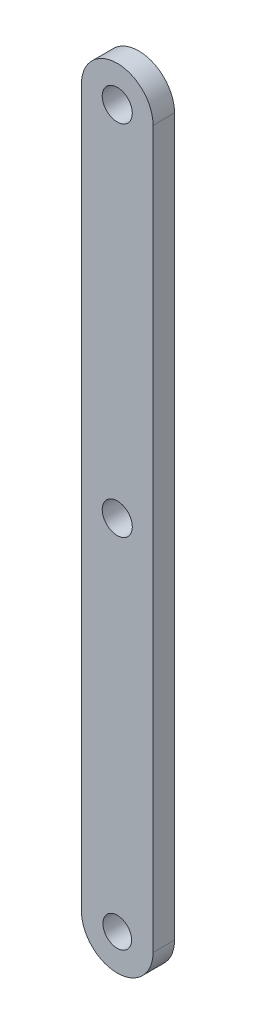
ISO-10303-21;
HEADER;
FILE_DESCRIPTION(('STEP AP214'),'2;1');
FILE_NAME('part.step','',(''),(''),'','','');
FILE_SCHEMA(('AUTOMOTIVE_DESIGN { 1 0 10303 214 1 1 1 1 }'));
ENDSEC;
DATA;
#1=APPLICATION_CONTEXT('core data for automotive mechanical design processes');
#2=APPLICATION_PROTOCOL_DEFINITION('international standard','automotive_design',2000,#1);
#3=PRODUCT_CONTEXT('',#1,'mechanical');
#4=PRODUCT('Part','Part','',(#3));
#5=PRODUCT_RELATED_PRODUCT_CATEGORY('part','',(#4));
#6=PRODUCT_DEFINITION_FORMATION('','',#4);
#7=PRODUCT_DEFINITION_CONTEXT('part definition',#1,'design');
#8=PRODUCT_DEFINITION('design','',#6,#7);
#9=PRODUCT_DEFINITION_SHAPE('','',#8);
#10=(LENGTH_UNIT() NAMED_UNIT(*) SI_UNIT(.MILLI.,.METRE.));
#11=(NAMED_UNIT(*) PLANE_ANGLE_UNIT() SI_UNIT($,.RADIAN.));
#12=(NAMED_UNIT(*) SI_UNIT($,.STERADIAN.) SOLID_ANGLE_UNIT());
#13=UNCERTAINTY_MEASURE_WITH_UNIT(LENGTH_MEASURE(1.E-05),#10,'distance_accuracy_value','');
#14=(GEOMETRIC_REPRESENTATION_CONTEXT(3) GLOBAL_UNCERTAINTY_ASSIGNED_CONTEXT((#13)) GLOBAL_UNIT_ASSIGNED_CONTEXT((#10,
#11,#12)) REPRESENTATION_CONTEXT('',''));
#15=CARTESIAN_POINT('',(0.,0.,0.));
#16=DIRECTION('',(0.,0.,1.));
#17=DIRECTION('',(1.,0.,0.));
#18=AXIS2_PLACEMENT_3D('',#15,#16,#17);
#19=CARTESIAN_POINT('',(0.,0.,1.5));
#20=DIRECTION('',(0.,0.,1.));
#21=DIRECTION('',(1.,0.,0.));
#22=AXIS2_PLACEMENT_3D('',#19,#20,#21);
#23=PLANE('',#22);
#24=CARTESIAN_POINT('',(0.,50.,1.5));
#25=DIRECTION('',(0.,0.,1.));
#26=DIRECTION('',(1.,0.,0.));
#27=AXIS2_PLACEMENT_3D('',#24,#25,#26);
#28=CIRCLE('',#27,1.05);
#29=CARTESIAN_POINT('',(1.05,50.,1.5));
#30=VERTEX_POINT('',#29);
#31=EDGE_CURVE('E134',#30,#30,#28,.T.);
#32=ORIENTED_EDGE('',*,*,#31,.F.);
#33=EDGE_LOOP('',(#32));
#34=FACE_BOUND('',#33,.T.);
#35=CARTESIAN_POINT('',(0.,0.,1.5));
#36=DIRECTION('',(0.,0.,1.));
#37=DIRECTION('',(1.,0.,0.));
#38=AXIS2_PLACEMENT_3D('',#35,#36,#37);
#39=CIRCLE('',#38,2.5);
#40=CARTESIAN_POINT('',(-2.5,0.,1.5));
#41=VERTEX_POINT('',#40);
#42=CARTESIAN_POINT('',(2.5,0.,1.5));
#43=VERTEX_POINT('',#42);
#44=EDGE_CURVE('E92',#41,#43,#39,.T.);
#45=ORIENTED_EDGE('',*,*,#44,.T.);
#46=DIRECTION('',(0.,1.,0.));
#47=VECTOR('',#46,1.);
#48=CARTESIAN_POINT('',(2.5,0.,1.5));
#49=LINE('',#48,#47);
#50=CARTESIAN_POINT('',(2.5,50.,1.5));
#51=VERTEX_POINT('',#50);
#52=EDGE_CURVE('E87',#43,#51,#49,.T.);
#53=ORIENTED_EDGE('',*,*,#52,.T.);
#54=CARTESIAN_POINT('',(0.,50.,1.5));
#55=DIRECTION('',(0.,0.,1.));
#56=DIRECTION('',(1.,0.,0.));
#57=AXIS2_PLACEMENT_3D('',#54,#55,#56);
#58=CIRCLE('',#57,2.5);
#59=CARTESIAN_POINT('',(-2.5,50.,1.5));
#60=VERTEX_POINT('',#59);
#61=EDGE_CURVE('E90',#51,#60,#58,.T.);
#62=ORIENTED_EDGE('',*,*,#61,.T.);
#63=DIRECTION('',(0.,-1.,0.));
#64=VECTOR('',#63,1.);
#65=CARTESIAN_POINT('',(-2.5,0.,1.5));
#66=LINE('',#65,#64);
#67=EDGE_CURVE('E57',#60,#41,#66,.T.);
#68=ORIENTED_EDGE('',*,*,#67,.T.);
#69=EDGE_LOOP('',(#45,#53,#62,#68));
#70=FACE_BOUND('',#69,.T.);
#71=CARTESIAN_POINT('',(0.,0.,1.5));
#72=DIRECTION('',(0.,0.,1.));
#73=DIRECTION('',(1.,0.,0.));
#74=AXIS2_PLACEMENT_3D('',#71,#72,#73);
#75=CIRCLE('',#74,1.);
#76=CARTESIAN_POINT('',(1.,0.,1.5));
#77=VERTEX_POINT('',#76);
#78=EDGE_CURVE('E112',#77,#77,#75,.T.);
#79=ORIENTED_EDGE('',*,*,#78,.F.);
#80=EDGE_LOOP('',(#79));
#81=FACE_BOUND('',#80,.T.);
#82=CARTESIAN_POINT('',(0.,25.,1.5));
#83=DIRECTION('',(0.,0.,1.));
#84=DIRECTION('',(1.,0.,0.));
#85=AXIS2_PLACEMENT_3D('',#82,#83,#84);
#86=CIRCLE('',#85,1.05);
#87=CARTESIAN_POINT('',(1.05,25.,1.5));
#88=VERTEX_POINT('',#87);
#89=EDGE_CURVE('E142',#88,#88,#86,.T.);
#90=ORIENTED_EDGE('',*,*,#89,.F.);
#91=EDGE_LOOP('',(#90));
#92=FACE_BOUND('',#91,.T.);
#93=ADVANCED_FACE('F39',(#34,#70,#81,#92),#23,.T.);
#94=CARTESIAN_POINT('',(0.,0.,0.));
#95=DIRECTION('',(0.,0.,1.));
#96=DIRECTION('',(1.,0.,0.));
#97=AXIS2_PLACEMENT_3D('',#94,#95,#96);
#98=PLANE('',#97);
#99=CARTESIAN_POINT('',(0.,0.,0.));
#100=DIRECTION('',(0.,0.,1.));
#101=DIRECTION('',(1.,0.,0.));
#102=AXIS2_PLACEMENT_3D('',#99,#100,#101);
#103=CIRCLE('',#102,2.5);
#104=CARTESIAN_POINT('',(-2.5,0.,0.));
#105=VERTEX_POINT('',#104);
#106=CARTESIAN_POINT('',(2.5,0.,0.));
#107=VERTEX_POINT('',#106);
#108=EDGE_CURVE('E108',#105,#107,#103,.T.);
#109=ORIENTED_EDGE('',*,*,#108,.F.);
#110=DIRECTION('',(0.,-1.,0.));
#111=VECTOR('',#110,1.);
#112=CARTESIAN_POINT('',(-2.5,0.,0.));
#113=LINE('',#112,#111);
#114=CARTESIAN_POINT('',(-2.5,50.,0.));
#115=VERTEX_POINT('',#114);
#116=EDGE_CURVE('E80',#115,#105,#113,.T.);
#117=ORIENTED_EDGE('',*,*,#116,.F.);
#118=CARTESIAN_POINT('',(0.,50.,0.));
#119=DIRECTION('',(0.,0.,1.));
#120=DIRECTION('',(1.,0.,0.));
#121=AXIS2_PLACEMENT_3D('',#118,#119,#120);
#122=CIRCLE('',#121,2.5);
#123=CARTESIAN_POINT('',(2.5,50.,0.));
#124=VERTEX_POINT('',#123);
#125=EDGE_CURVE('E74',#124,#115,#122,.T.);
#126=ORIENTED_EDGE('',*,*,#125,.F.);
#127=DIRECTION('',(0.,1.,0.));
#128=VECTOR('',#127,1.);
#129=CARTESIAN_POINT('',(2.5,0.,0.));
#130=LINE('',#129,#128);
#131=EDGE_CURVE('E97',#107,#124,#130,.T.);
#132=ORIENTED_EDGE('',*,*,#131,.F.);
#133=EDGE_LOOP('',(#109,#117,#126,#132));
#134=FACE_BOUND('',#133,.T.);
#135=CARTESIAN_POINT('',(0.,0.,0.));
#136=DIRECTION('',(0.,0.,1.));
#137=DIRECTION('',(1.,0.,0.));
#138=AXIS2_PLACEMENT_3D('',#135,#136,#137);
#139=CIRCLE('',#138,1.);
#140=CARTESIAN_POINT('',(1.,0.,0.));
#141=VERTEX_POINT('',#140);
#142=EDGE_CURVE('E130',#141,#141,#139,.T.);
#143=ORIENTED_EDGE('',*,*,#142,.T.);
#144=EDGE_LOOP('',(#143));
#145=FACE_BOUND('',#144,.T.);
#146=CARTESIAN_POINT('',(0.,50.,0.));
#147=DIRECTION('',(0.,0.,1.));
#148=DIRECTION('',(1.,0.,0.));
#149=AXIS2_PLACEMENT_3D('',#146,#147,#148);
#150=CIRCLE('',#149,1.05);
#151=CARTESIAN_POINT('',(1.05,50.,0.));
#152=VERTEX_POINT('',#151);
#153=EDGE_CURVE('E138',#152,#152,#150,.T.);
#154=ORIENTED_EDGE('',*,*,#153,.T.);
#155=EDGE_LOOP('',(#154));
#156=FACE_BOUND('',#155,.T.);
#157=CARTESIAN_POINT('',(0.,25.,0.));
#158=DIRECTION('',(0.,0.,1.));
#159=DIRECTION('',(1.,0.,0.));
#160=AXIS2_PLACEMENT_3D('',#157,#158,#159);
#161=CIRCLE('',#160,1.05);
#162=CARTESIAN_POINT('',(1.05,25.,0.));
#163=VERTEX_POINT('',#162);
#164=EDGE_CURVE('E146',#163,#163,#161,.T.);
#165=ORIENTED_EDGE('',*,*,#164,.T.);
#166=EDGE_LOOP('',(#165));
#167=FACE_BOUND('',#166,.T.);
#168=ADVANCED_FACE('F125',(#134,#145,#156,#167),#98,.F.);
#169=CARTESIAN_POINT('',(0.,0.,1.5));
#170=DIRECTION('',(0.,0.,-1.));
#171=DIRECTION('',(-1.,0.,0.));
#172=AXIS2_PLACEMENT_3D('',#169,#170,#171);
#173=CYLINDRICAL_SURFACE('',#172,2.5);
#174=ORIENTED_EDGE('',*,*,#108,.T.);
#175=DIRECTION('',(0.,0.,-1.));
#176=VECTOR('',#175,1.);
#177=CARTESIAN_POINT('',(2.5,0.,1.5));
#178=LINE('',#177,#176);
#179=EDGE_CURVE('E11',#43,#107,#178,.T.);
#180=ORIENTED_EDGE('',*,*,#179,.F.);
#181=ORIENTED_EDGE('',*,*,#44,.F.);
#182=DIRECTION('',(0.,0.,-1.));
#183=VECTOR('',#182,1.);
#184=CARTESIAN_POINT('',(-2.5,0.,1.5));
#185=LINE('',#184,#183);
#186=EDGE_CURVE('E104',#41,#105,#185,.T.);
#187=ORIENTED_EDGE('',*,*,#186,.T.);
#188=EDGE_LOOP('',(#174,#180,#181,#187));
#189=FACE_BOUND('',#188,.T.);
#190=ADVANCED_FACE('F41',(#189),#173,.T.);
#191=CARTESIAN_POINT('',(2.5,0.,1.5));
#192=DIRECTION('',(-1.,0.,0.));
#193=DIRECTION('',(0.,0.,1.));
#194=AXIS2_PLACEMENT_3D('',#191,#192,#193);
#195=PLANE('',#194);
#196=ORIENTED_EDGE('',*,*,#131,.T.);
#197=DIRECTION('',(0.,0.,-1.));
#198=VECTOR('',#197,1.);
#199=CARTESIAN_POINT('',(2.5,50.,1.5));
#200=LINE('',#199,#198);
#201=EDGE_CURVE('E49',#51,#124,#200,.T.);
#202=ORIENTED_EDGE('',*,*,#201,.F.);
#203=ORIENTED_EDGE('',*,*,#52,.F.);
#204=ORIENTED_EDGE('',*,*,#179,.T.);
#205=EDGE_LOOP('',(#196,#202,#203,#204));
#206=FACE_BOUND('',#205,.T.);
#207=ADVANCED_FACE('F96',(#206),#195,.F.);
#208=CARTESIAN_POINT('',(0.,50.,1.5));
#209=DIRECTION('',(0.,0.,-1.));
#210=DIRECTION('',(-1.,0.,0.));
#211=AXIS2_PLACEMENT_3D('',#208,#209,#210);
#212=CYLINDRICAL_SURFACE('',#211,2.5);
#213=ORIENTED_EDGE('',*,*,#125,.T.);
#214=DIRECTION('',(0.,0.,-1.));
#215=VECTOR('',#214,1.);
#216=CARTESIAN_POINT('',(-2.5,50.,1.5));
#217=LINE('',#216,#215);
#218=EDGE_CURVE('E99',#60,#115,#217,.T.);
#219=ORIENTED_EDGE('',*,*,#218,.F.);
#220=ORIENTED_EDGE('',*,*,#61,.F.);
#221=ORIENTED_EDGE('',*,*,#201,.T.);
#222=EDGE_LOOP('',(#213,#219,#220,#221));
#223=FACE_BOUND('',#222,.T.);
#224=ADVANCED_FACE('F100',(#223),#212,.T.);
#225=CARTESIAN_POINT('',(-2.5,0.,1.5));
#226=DIRECTION('',(1.,0.,0.));
#227=DIRECTION('',(0.,0.,-1.));
#228=AXIS2_PLACEMENT_3D('',#225,#226,#227);
#229=PLANE('',#228);
#230=ORIENTED_EDGE('',*,*,#116,.T.);
#231=ORIENTED_EDGE('',*,*,#186,.F.);
#232=ORIENTED_EDGE('',*,*,#67,.F.);
#233=ORIENTED_EDGE('',*,*,#218,.T.);
#234=EDGE_LOOP('',(#230,#231,#232,#233));
#235=FACE_BOUND('',#234,.T.);
#236=ADVANCED_FACE('F122',(#235),#229,.F.);
#237=CARTESIAN_POINT('',(0.,0.,1.5));
#238=DIRECTION('',(0.,0.,-1.));
#239=DIRECTION('',(-1.,0.,0.));
#240=AXIS2_PLACEMENT_3D('',#237,#238,#239);
#241=CYLINDRICAL_SURFACE('',#240,1.);
#242=ORIENTED_EDGE('',*,*,#78,.T.);
#243=EDGE_LOOP('',(#242));
#244=FACE_BOUND('',#243,.T.);
#245=ORIENTED_EDGE('',*,*,#142,.F.);
#246=EDGE_LOOP('',(#245));
#247=FACE_BOUND('',#246,.T.);
#248=ADVANCED_FACE('F166',(#244,#247),#241,.F.);
#249=CARTESIAN_POINT('',(0.,50.,1.5));
#250=DIRECTION('',(0.,0.,-1.));
#251=DIRECTION('',(-1.,0.,0.));
#252=AXIS2_PLACEMENT_3D('',#249,#250,#251);
#253=CYLINDRICAL_SURFACE('',#252,1.05);
#254=ORIENTED_EDGE('',*,*,#31,.T.);
#255=EDGE_LOOP('',(#254));
#256=FACE_BOUND('',#255,.T.);
#257=ORIENTED_EDGE('',*,*,#153,.F.);
#258=EDGE_LOOP('',(#257));
#259=FACE_BOUND('',#258,.T.);
#260=ADVANCED_FACE('F212',(#256,#259),#253,.F.);
#261=CARTESIAN_POINT('',(0.,25.,1.5));
#262=DIRECTION('',(0.,0.,-1.));
#263=DIRECTION('',(-1.,0.,0.));
#264=AXIS2_PLACEMENT_3D('',#261,#262,#263);
#265=CYLINDRICAL_SURFACE('',#264,1.05);
#266=ORIENTED_EDGE('',*,*,#89,.T.);
#267=EDGE_LOOP('',(#266));
#268=FACE_BOUND('',#267,.T.);
#269=ORIENTED_EDGE('',*,*,#164,.F.);
#270=EDGE_LOOP('',(#269));
#271=FACE_BOUND('',#270,.T.);
#272=ADVANCED_FACE('F154',(#268,#271),#265,.F.);
#273=CLOSED_SHELL('',(#93,#168,#190,#207,#224,#236,#248,#260,#272));
#274=MANIFOLD_SOLID_BREP('B2',#273);
#275=ADVANCED_BREP_SHAPE_REPRESENTATION('',(#18,#274),#14);
#276=SHAPE_DEFINITION_REPRESENTATION(#9,#275);
ENDSEC;
END-ISO-10303-21;
